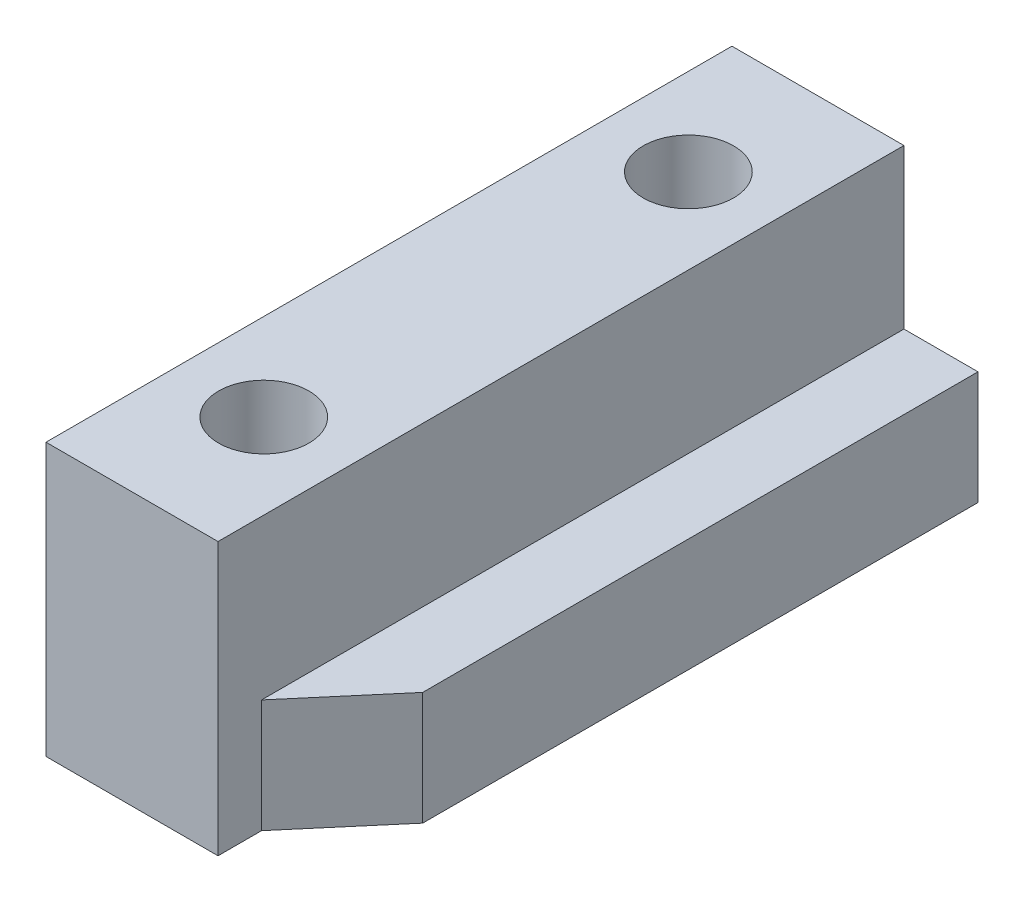
ISO-10303-21;
HEADER;
FILE_DESCRIPTION(('STEP AP214'),'2;1');
FILE_NAME('part.step','',(''),(''),'','','');
FILE_SCHEMA(('AUTOMOTIVE_DESIGN { 1 0 10303 214 1 1 1 1 }'));
ENDSEC;
DATA;
#1=APPLICATION_CONTEXT('core data for automotive mechanical design processes');
#2=APPLICATION_PROTOCOL_DEFINITION('international standard','automotive_design',2000,#1);
#3=PRODUCT_CONTEXT('',#1,'mechanical');
#4=PRODUCT('Part','Part','',(#3));
#5=PRODUCT_RELATED_PRODUCT_CATEGORY('part','',(#4));
#6=PRODUCT_DEFINITION_FORMATION('','',#4);
#7=PRODUCT_DEFINITION_CONTEXT('part definition',#1,'design');
#8=PRODUCT_DEFINITION('design','',#6,#7);
#9=PRODUCT_DEFINITION_SHAPE('','',#8);
#10=(LENGTH_UNIT() NAMED_UNIT(*) SI_UNIT(.MILLI.,.METRE.));
#11=(NAMED_UNIT(*) PLANE_ANGLE_UNIT() SI_UNIT($,.RADIAN.));
#12=(NAMED_UNIT(*) SI_UNIT($,.STERADIAN.) SOLID_ANGLE_UNIT());
#13=UNCERTAINTY_MEASURE_WITH_UNIT(LENGTH_MEASURE(1.E-05),#10,'distance_accuracy_value','');
#14=(GEOMETRIC_REPRESENTATION_CONTEXT(3) GLOBAL_UNCERTAINTY_ASSIGNED_CONTEXT((#13)) GLOBAL_UNIT_ASSIGNED_CONTEXT((#10,
#11,#12)) REPRESENTATION_CONTEXT('',''));
#15=CARTESIAN_POINT('',(0.,0.,0.));
#16=DIRECTION('',(0.,0.,1.));
#17=DIRECTION('',(1.,0.,0.));
#18=AXIS2_PLACEMENT_3D('',#15,#16,#17);
#19=CARTESIAN_POINT('',(11.3,0.,-31.5));
#20=DIRECTION('',(0.,-1.,0.));
#21=DIRECTION('',(0.,0.,-1.));
#22=AXIS2_PLACEMENT_3D('',#19,#20,#21);
#23=PLANE('',#22);
#24=DIRECTION('',(0.64764842009554,0.,-0.761939317759459));
#25=VECTOR('',#24,1.);
#26=CARTESIAN_POINT('',(11.3,0.,-6.));
#27=LINE('',#26,#25);
#28=CARTESIAN_POINT('',(7.9,0.,-2.));
#29=VERTEX_POINT('',#28);
#30=CARTESIAN_POINT('',(11.3,0.,-6.));
#31=VERTEX_POINT('',#30);
#32=EDGE_CURVE('E144',#29,#31,#27,.T.);
#33=ORIENTED_EDGE('',*,*,#32,.F.);
#34=DIRECTION('',(0.,0.,-1.));
#35=VECTOR('',#34,1.);
#36=CARTESIAN_POINT('',(7.9,0.,-2.));
#37=LINE('',#36,#35);
#38=CARTESIAN_POINT('',(7.9,0.,0.));
#39=VERTEX_POINT('',#38);
#40=EDGE_CURVE('E155',#39,#29,#37,.T.);
#41=ORIENTED_EDGE('',*,*,#40,.F.);
#42=DIRECTION('',(1.,0.,0.));
#43=VECTOR('',#42,1.);
#44=CARTESIAN_POINT('',(11.3,0.,0.));
#45=LINE('',#44,#43);
#46=CARTESIAN_POINT('',(0.,0.,0.));
#47=VERTEX_POINT('',#46);
#48=EDGE_CURVE('E125',#47,#39,#45,.T.);
#49=ORIENTED_EDGE('',*,*,#48,.F.);
#50=DIRECTION('',(0.,0.,1.));
#51=VECTOR('',#50,1.);
#52=CARTESIAN_POINT('',(0.,0.,-31.5));
#53=LINE('',#52,#51);
#54=CARTESIAN_POINT('',(0.,0.,-31.5));
#55=VERTEX_POINT('',#54);
#56=EDGE_CURVE('E11',#55,#47,#53,.T.);
#57=ORIENTED_EDGE('',*,*,#56,.F.);
#58=DIRECTION('',(1.,0.,0.));
#59=VECTOR('',#58,1.);
#60=CARTESIAN_POINT('',(11.3,0.,-31.5));
#61=LINE('',#60,#59);
#62=CARTESIAN_POINT('',(11.3,0.,-31.5));
#63=VERTEX_POINT('',#62);
#64=EDGE_CURVE('E134',#55,#63,#61,.T.);
#65=ORIENTED_EDGE('',*,*,#64,.T.);
#66=DIRECTION('',(0.,0.,1.));
#67=VECTOR('',#66,1.);
#68=CARTESIAN_POINT('',(11.3,0.,-31.5));
#69=LINE('',#68,#67);
#70=EDGE_CURVE('E46',#63,#31,#69,.T.);
#71=ORIENTED_EDGE('',*,*,#70,.T.);
#72=EDGE_LOOP('',(#33,#41,#49,#57,#65,#71));
#73=FACE_BOUND('',#72,.T.);
#74=ADVANCED_FACE('F43',(#73),#23,.T.);
#75=CARTESIAN_POINT('',(0.,0.,-31.5));
#76=DIRECTION('',(-1.,0.,0.));
#77=DIRECTION('',(0.,0.,1.));
#78=AXIS2_PLACEMENT_3D('',#75,#76,#77);
#79=PLANE('',#78);
#80=DIRECTION('',(0.,-1.,0.));
#81=VECTOR('',#80,1.);
#82=CARTESIAN_POINT('',(0.,0.,0.));
#83=LINE('',#82,#81);
#84=CARTESIAN_POINT('',(0.,12.5,0.));
#85=VERTEX_POINT('',#84);
#86=EDGE_CURVE('E132',#85,#47,#83,.T.);
#87=ORIENTED_EDGE('',*,*,#86,.F.);
#88=DIRECTION('',(0.,0.,1.));
#89=VECTOR('',#88,1.);
#90=CARTESIAN_POINT('',(0.,12.5,-31.5));
#91=LINE('',#90,#89);
#92=CARTESIAN_POINT('',(0.,12.5,-31.5));
#93=VERTEX_POINT('',#92);
#94=EDGE_CURVE('E52',#93,#85,#91,.T.);
#95=ORIENTED_EDGE('',*,*,#94,.F.);
#96=DIRECTION('',(0.,-1.,0.));
#97=VECTOR('',#96,1.);
#98=CARTESIAN_POINT('',(0.,0.,-31.5));
#99=LINE('',#98,#97);
#100=EDGE_CURVE('E113',#93,#55,#99,.T.);
#101=ORIENTED_EDGE('',*,*,#100,.T.);
#102=ORIENTED_EDGE('',*,*,#56,.T.);
#103=EDGE_LOOP('',(#87,#95,#101,#102));
#104=FACE_BOUND('',#103,.T.);
#105=ADVANCED_FACE('F159',(#104),#79,.T.);
#106=CARTESIAN_POINT('',(0.,12.5,-31.5));
#107=DIRECTION('',(0.,1.,0.));
#108=DIRECTION('',(0.,0.,1.));
#109=AXIS2_PLACEMENT_3D('',#106,#107,#108);
#110=PLANE('',#109);
#111=CARTESIAN_POINT('',(4.,12.5,-6.));
#112=DIRECTION('',(0.,1.,0.));
#113=DIRECTION('',(0.,0.,1.));
#114=AXIS2_PLACEMENT_3D('',#111,#112,#113);
#115=CIRCLE('',#114,2.075);
#116=CARTESIAN_POINT('',(4.,12.5,-3.925));
#117=VERTEX_POINT('',#116);
#118=EDGE_CURVE('E194',#117,#117,#115,.T.);
#119=ORIENTED_EDGE('',*,*,#118,.F.);
#120=EDGE_LOOP('',(#119));
#121=FACE_BOUND('',#120,.T.);
#122=CARTESIAN_POINT('',(4.,12.5,-25.5));
#123=DIRECTION('',(0.,1.,0.));
#124=DIRECTION('',(0.,0.,1.));
#125=AXIS2_PLACEMENT_3D('',#122,#123,#124);
#126=CIRCLE('',#125,2.075);
#127=CARTESIAN_POINT('',(4.,12.5,-23.425));
#128=VERTEX_POINT('',#127);
#129=EDGE_CURVE('E197',#128,#128,#126,.T.);
#130=ORIENTED_EDGE('',*,*,#129,.F.);
#131=EDGE_LOOP('',(#130));
#132=FACE_BOUND('',#131,.T.);
#133=DIRECTION('',(-1.,0.,0.));
#134=VECTOR('',#133,1.);
#135=CARTESIAN_POINT('',(0.,12.5,0.));
#136=LINE('',#135,#134);
#137=CARTESIAN_POINT('',(7.9,12.5,0.));
#138=VERTEX_POINT('',#137);
#139=EDGE_CURVE('E101',#138,#85,#136,.T.);
#140=ORIENTED_EDGE('',*,*,#139,.F.);
#141=DIRECTION('',(0.,0.,1.));
#142=VECTOR('',#141,1.);
#143=CARTESIAN_POINT('',(7.9,12.5,-31.5));
#144=LINE('',#143,#142);
#145=CARTESIAN_POINT('',(7.9,12.5,-31.5));
#146=VERTEX_POINT('',#145);
#147=EDGE_CURVE('E96',#146,#138,#144,.T.);
#148=ORIENTED_EDGE('',*,*,#147,.F.);
#149=DIRECTION('',(-1.,0.,0.));
#150=VECTOR('',#149,1.);
#151=CARTESIAN_POINT('',(0.,12.5,-31.5));
#152=LINE('',#151,#150);
#153=EDGE_CURVE('E99',#146,#93,#152,.T.);
#154=ORIENTED_EDGE('',*,*,#153,.T.);
#155=ORIENTED_EDGE('',*,*,#94,.T.);
#156=EDGE_LOOP('',(#140,#148,#154,#155));
#157=FACE_BOUND('',#156,.T.);
#158=ADVANCED_FACE('F98',(#121,#132,#157),#110,.T.);
#159=CARTESIAN_POINT('',(7.9,12.5,-31.5));
#160=DIRECTION('',(1.,0.,0.));
#161=DIRECTION('',(0.,1.,0.));
#162=AXIS2_PLACEMENT_3D('',#159,#160,#161);
#163=PLANE('',#162);
#164=DIRECTION('',(0.,-1.,0.));
#165=VECTOR('',#164,1.);
#166=CARTESIAN_POINT('',(7.9,10.,-2.));
#167=LINE('',#166,#165);
#168=CARTESIAN_POINT('',(7.9,5.2,-2.));
#169=VERTEX_POINT('',#168);
#170=EDGE_CURVE('E185',#169,#29,#167,.T.);
#171=ORIENTED_EDGE('',*,*,#170,.F.);
#172=DIRECTION('',(0.,0.,1.));
#173=VECTOR('',#172,1.);
#174=CARTESIAN_POINT('',(7.9,5.2,-31.5));
#175=LINE('',#174,#173);
#176=CARTESIAN_POINT('',(7.9,5.2,-31.5));
#177=VERTEX_POINT('',#176);
#178=EDGE_CURVE('E105',#177,#169,#175,.T.);
#179=ORIENTED_EDGE('',*,*,#178,.F.);
#180=DIRECTION('',(0.,1.,0.));
#181=VECTOR('',#180,1.);
#182=CARTESIAN_POINT('',(7.9,12.5,-31.5));
#183=LINE('',#182,#181);
#184=EDGE_CURVE('E111',#177,#146,#183,.T.);
#185=ORIENTED_EDGE('',*,*,#184,.T.);
#186=ORIENTED_EDGE('',*,*,#147,.T.);
#187=DIRECTION('',(0.,1.,0.));
#188=VECTOR('',#187,1.);
#189=CARTESIAN_POINT('',(7.9,12.5,0.));
#190=LINE('',#189,#188);
#191=EDGE_CURVE('E128',#39,#138,#190,.T.);
#192=ORIENTED_EDGE('',*,*,#191,.F.);
#193=ORIENTED_EDGE('',*,*,#40,.T.);
#194=EDGE_LOOP('',(#171,#179,#185,#186,#192,#193));
#195=FACE_BOUND('',#194,.T.);
#196=ADVANCED_FACE('F116',(#195),#163,.T.);
#197=CARTESIAN_POINT('',(7.9,5.2,-31.5));
#198=DIRECTION('',(0.,1.,0.));
#199=DIRECTION('',(0.,0.,1.));
#200=AXIS2_PLACEMENT_3D('',#197,#198,#199);
#201=PLANE('',#200);
#202=DIRECTION('',(-0.64764842009554,0.,0.761939317759459));
#203=VECTOR('',#202,1.);
#204=CARTESIAN_POINT('',(22.4573294629898,5.2,-19.1262699564586));
#205=LINE('',#204,#203);
#206=CARTESIAN_POINT('',(11.3,5.2,-6.));
#207=VERTEX_POINT('',#206);
#208=EDGE_CURVE('E184',#207,#169,#205,.T.);
#209=ORIENTED_EDGE('',*,*,#208,.F.);
#210=DIRECTION('',(0.,0.,1.));
#211=VECTOR('',#210,1.);
#212=CARTESIAN_POINT('',(11.3,5.2,-31.5));
#213=LINE('',#212,#211);
#214=CARTESIAN_POINT('',(11.3,5.2,-31.5));
#215=VERTEX_POINT('',#214);
#216=EDGE_CURVE('E137',#215,#207,#213,.T.);
#217=ORIENTED_EDGE('',*,*,#216,.F.);
#218=DIRECTION('',(-1.,0.,0.));
#219=VECTOR('',#218,1.);
#220=CARTESIAN_POINT('',(7.9,5.2,-31.5));
#221=LINE('',#220,#219);
#222=EDGE_CURVE('E118',#215,#177,#221,.T.);
#223=ORIENTED_EDGE('',*,*,#222,.T.);
#224=ORIENTED_EDGE('',*,*,#178,.T.);
#225=EDGE_LOOP('',(#209,#217,#223,#224));
#226=FACE_BOUND('',#225,.T.);
#227=ADVANCED_FACE('F174',(#226),#201,.T.);
#228=CARTESIAN_POINT('',(11.3,5.2,-31.5));
#229=DIRECTION('',(1.,0.,0.));
#230=DIRECTION('',(0.,0.,-1.));
#231=AXIS2_PLACEMENT_3D('',#228,#229,#230);
#232=PLANE('',#231);
#233=DIRECTION('',(0.,-1.,0.));
#234=VECTOR('',#233,1.);
#235=CARTESIAN_POINT('',(11.3,10.,-6.));
#236=LINE('',#235,#234);
#237=EDGE_CURVE('E182',#207,#31,#236,.T.);
#238=ORIENTED_EDGE('',*,*,#237,.T.);
#239=ORIENTED_EDGE('',*,*,#70,.F.);
#240=DIRECTION('',(0.,1.,0.));
#241=VECTOR('',#240,1.);
#242=CARTESIAN_POINT('',(11.3,5.2,-31.5));
#243=LINE('',#242,#241);
#244=EDGE_CURVE('E120',#63,#215,#243,.T.);
#245=ORIENTED_EDGE('',*,*,#244,.T.);
#246=ORIENTED_EDGE('',*,*,#216,.T.);
#247=EDGE_LOOP('',(#238,#239,#245,#246));
#248=FACE_BOUND('',#247,.T.);
#249=ADVANCED_FACE('F176',(#248),#232,.T.);
#250=CARTESIAN_POINT('',(0.,0.,-31.5));
#251=DIRECTION('',(0.,0.,-1.));
#252=DIRECTION('',(-1.,0.,0.));
#253=AXIS2_PLACEMENT_3D('',#250,#251,#252);
#254=PLANE('',#253);
#255=ORIENTED_EDGE('',*,*,#64,.F.);
#256=ORIENTED_EDGE('',*,*,#100,.F.);
#257=ORIENTED_EDGE('',*,*,#153,.F.);
#258=ORIENTED_EDGE('',*,*,#184,.F.);
#259=ORIENTED_EDGE('',*,*,#222,.F.);
#260=ORIENTED_EDGE('',*,*,#244,.F.);
#261=EDGE_LOOP('',(#255,#256,#257,#258,#259,#260));
#262=FACE_BOUND('',#261,.T.);
#263=ADVANCED_FACE('F109',(#262),#254,.T.);
#264=CARTESIAN_POINT('',(0.,0.,0.));
#265=DIRECTION('',(0.,0.,-1.));
#266=DIRECTION('',(-1.,0.,0.));
#267=AXIS2_PLACEMENT_3D('',#264,#265,#266);
#268=PLANE('',#267);
#269=ORIENTED_EDGE('',*,*,#48,.T.);
#270=ORIENTED_EDGE('',*,*,#191,.T.);
#271=ORIENTED_EDGE('',*,*,#139,.T.);
#272=ORIENTED_EDGE('',*,*,#86,.T.);
#273=EDGE_LOOP('',(#269,#270,#271,#272));
#274=FACE_BOUND('',#273,.T.);
#275=ADVANCED_FACE('F158',(#274),#268,.F.);
#276=CARTESIAN_POINT('',(4.,5.5,-25.5));
#277=DIRECTION('',(0.,1.,0.));
#278=DIRECTION('',(0.,0.,1.));
#279=AXIS2_PLACEMENT_3D('',#276,#277,#278);
#280=CYLINDRICAL_SURFACE('',#279,2.075);
#281=CARTESIAN_POINT('',(4.,5.5,-25.5));
#282=DIRECTION('',(0.,1.,0.));
#283=DIRECTION('',(0.,0.,1.));
#284=AXIS2_PLACEMENT_3D('',#281,#282,#283);
#285=CIRCLE('',#284,2.075);
#286=CARTESIAN_POINT('',(4.,5.5,-23.425));
#287=VERTEX_POINT('',#286);
#288=EDGE_CURVE('E187',#287,#287,#285,.T.);
#289=ORIENTED_EDGE('',*,*,#288,.F.);
#290=EDGE_LOOP('',(#289));
#291=FACE_BOUND('',#290,.T.);
#292=ORIENTED_EDGE('',*,*,#129,.T.);
#293=EDGE_LOOP('',(#292));
#294=FACE_BOUND('',#293,.T.);
#295=ADVANCED_FACE('F217',(#291,#294),#280,.F.);
#296=CARTESIAN_POINT('',(4.,5.5,-25.5));
#297=DIRECTION('',(0.,1.,0.));
#298=DIRECTION('',(0.,0.,1.));
#299=AXIS2_PLACEMENT_3D('',#296,#297,#298);
#300=PLANE('',#299);
#301=ORIENTED_EDGE('',*,*,#288,.T.);
#302=EDGE_LOOP('',(#301));
#303=FACE_BOUND('',#302,.T.);
#304=ADVANCED_FACE('F215',(#303),#300,.T.);
#305=CARTESIAN_POINT('',(4.,5.5,-6.));
#306=DIRECTION('',(0.,1.,0.));
#307=DIRECTION('',(0.,0.,1.));
#308=AXIS2_PLACEMENT_3D('',#305,#306,#307);
#309=CYLINDRICAL_SURFACE('',#308,2.075);
#310=CARTESIAN_POINT('',(4.,5.5,-6.));
#311=DIRECTION('',(0.,1.,0.));
#312=DIRECTION('',(0.,0.,1.));
#313=AXIS2_PLACEMENT_3D('',#310,#311,#312);
#314=CIRCLE('',#313,2.075);
#315=CARTESIAN_POINT('',(4.,5.5,-3.925));
#316=VERTEX_POINT('',#315);
#317=EDGE_CURVE('E129',#316,#316,#314,.T.);
#318=ORIENTED_EDGE('',*,*,#317,.F.);
#319=EDGE_LOOP('',(#318));
#320=FACE_BOUND('',#319,.T.);
#321=ORIENTED_EDGE('',*,*,#118,.T.);
#322=EDGE_LOOP('',(#321));
#323=FACE_BOUND('',#322,.T.);
#324=ADVANCED_FACE('F209',(#320,#323),#309,.F.);
#325=CARTESIAN_POINT('',(4.,5.5,-6.));
#326=DIRECTION('',(0.,1.,0.));
#327=DIRECTION('',(0.,0.,1.));
#328=AXIS2_PLACEMENT_3D('',#325,#326,#327);
#329=PLANE('',#328);
#330=ORIENTED_EDGE('',*,*,#317,.T.);
#331=EDGE_LOOP('',(#330));
#332=FACE_BOUND('',#331,.T.);
#333=ADVANCED_FACE('F204',(#332),#329,.T.);
#334=CARTESIAN_POINT('',(11.3,10.,-6.));
#335=DIRECTION('',(-0.761939317759459,0.,-0.64764842009554));
#336=DIRECTION('',(-0.64764842009554,0.,0.761939317759459));
#337=AXIS2_PLACEMENT_3D('',#334,#335,#336);
#338=PLANE('',#337);
#339=ORIENTED_EDGE('',*,*,#208,.T.);
#340=ORIENTED_EDGE('',*,*,#170,.T.);
#341=ORIENTED_EDGE('',*,*,#32,.T.);
#342=ORIENTED_EDGE('',*,*,#237,.F.);
#343=EDGE_LOOP('',(#339,#340,#341,#342));
#344=FACE_BOUND('',#343,.T.);
#345=ADVANCED_FACE('F202',(#344),#338,.F.);
#346=CLOSED_SHELL('',(#74,#105,#158,#196,#227,#249,#263,#275,#295,#304,#324,#333,#345));
#347=MANIFOLD_SOLID_BREP('B2',#346);
#348=ADVANCED_BREP_SHAPE_REPRESENTATION('',(#18,#347),#14);
#349=SHAPE_DEFINITION_REPRESENTATION(#9,#348);
ENDSEC;
END-ISO-10303-21;
